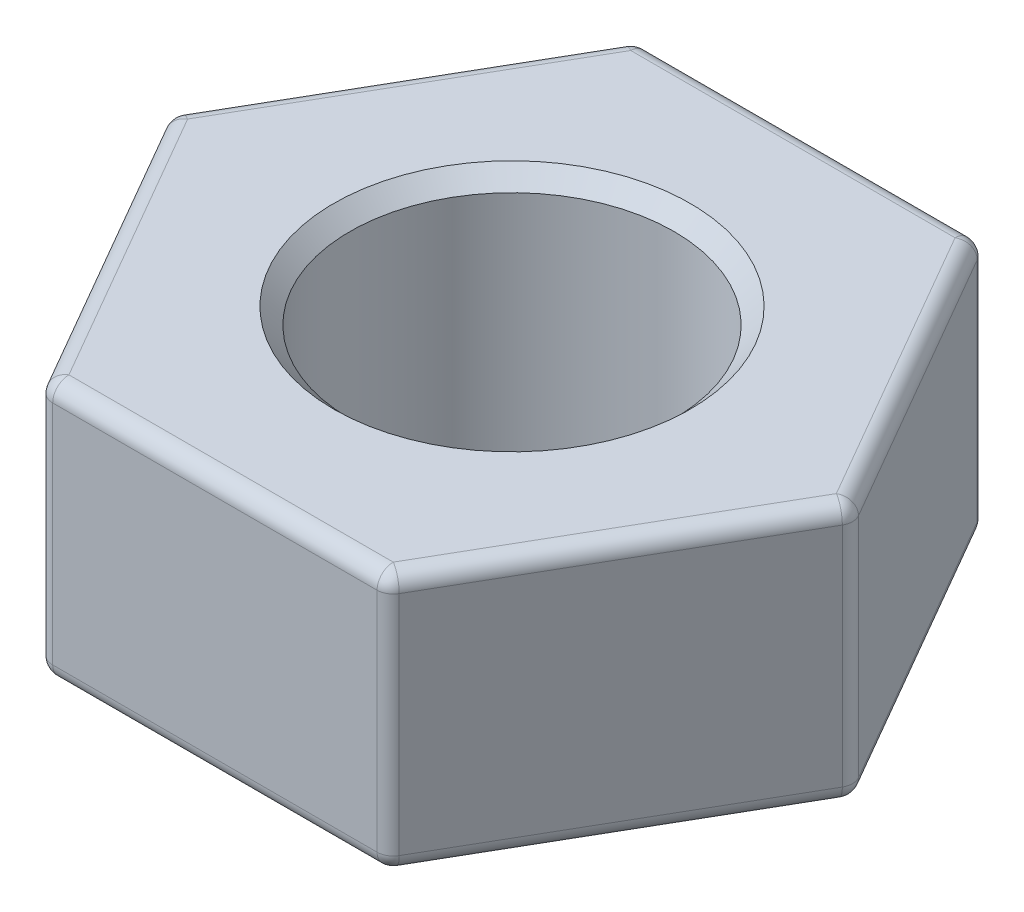
ISO-10303-21;
HEADER;
FILE_DESCRIPTION(('STEP AP214'),'2;1');
FILE_NAME('part.step','',(''),(''),'','','');
FILE_SCHEMA(('AUTOMOTIVE_DESIGN { 1 0 10303 214 1 1 1 1 }'));
ENDSEC;
DATA;
#1=APPLICATION_CONTEXT('core data for automotive mechanical design processes');
#2=APPLICATION_PROTOCOL_DEFINITION('international standard','automotive_design',2000,#1);
#3=PRODUCT_CONTEXT('',#1,'mechanical');
#4=PRODUCT('Part','Part','',(#3));
#5=PRODUCT_RELATED_PRODUCT_CATEGORY('part','',(#4));
#6=PRODUCT_DEFINITION_FORMATION('','',#4);
#7=PRODUCT_DEFINITION_CONTEXT('part definition',#1,'design');
#8=PRODUCT_DEFINITION('design','',#6,#7);
#9=PRODUCT_DEFINITION_SHAPE('','',#8);
#10=(LENGTH_UNIT() NAMED_UNIT(*) SI_UNIT(.MILLI.,.METRE.));
#11=(NAMED_UNIT(*) PLANE_ANGLE_UNIT() SI_UNIT($,.RADIAN.));
#12=(NAMED_UNIT(*) SI_UNIT($,.STERADIAN.) SOLID_ANGLE_UNIT());
#13=UNCERTAINTY_MEASURE_WITH_UNIT(LENGTH_MEASURE(1.E-05),#10,'distance_accuracy_value','');
#14=(GEOMETRIC_REPRESENTATION_CONTEXT(3) GLOBAL_UNCERTAINTY_ASSIGNED_CONTEXT((#13)) GLOBAL_UNIT_ASSIGNED_CONTEXT((#10,
#11,#12)) REPRESENTATION_CONTEXT('',''));
#15=CARTESIAN_POINT('',(0.,0.,0.));
#16=DIRECTION('',(0.,0.,1.));
#17=DIRECTION('',(1.,0.,0.));
#18=AXIS2_PLACEMENT_3D('',#15,#16,#17);
#19=CARTESIAN_POINT('',(0.,2.4,0.));
#20=DIRECTION('',(0.,1.,0.));
#21=DIRECTION('',(0.,0.,1.));
#22=AXIS2_PLACEMENT_3D('',#19,#20,#21);
#23=PLANE('',#22);
#24=CARTESIAN_POINT('',(0.,2.4,0.));
#25=DIRECTION('',(0.,1.,0.));
#26=DIRECTION('',(0.,0.,1.));
#27=AXIS2_PLACEMENT_3D('',#24,#25,#26);
#28=CIRCLE('',#27,1.65);
#29=CARTESIAN_POINT('',(0.,2.4,1.65));
#30=VERTEX_POINT('',#29);
#31=EDGE_CURVE('E11',#30,#30,#28,.F.);
#32=ORIENTED_EDGE('',*,*,#31,.T.);
#33=EDGE_LOOP('',(#32));
#34=FACE_BOUND('',#33,.T.);
#35=DIRECTION('',(-0.499999999999995,0.,0.866025403784442));
#36=VECTOR('',#35,1.);
#37=CARTESIAN_POINT('',(-3.04552266997528,2.4,0.0750000000000215));
#38=LINE('',#37,#36);
#39=CARTESIAN_POINT('',(-1.50111069989304,2.4,-2.59999999999999));
#40=VERTEX_POINT('',#39);
#41=CARTESIAN_POINT('',(-3.00222139978605,2.4,0.));
#42=VERTEX_POINT('',#41);
#43=EDGE_CURVE('E58',#40,#42,#38,.T.);
#44=ORIENTED_EDGE('',*,*,#43,.T.);
#45=DIRECTION('',(0.500000000000007,0.,0.866025403784435));
#46=VECTOR('',#45,1.);
#47=CARTESIAN_POINT('',(-1.45780942970378,2.4,2.67500000000002));
#48=LINE('',#47,#46);
#49=CARTESIAN_POINT('',(-1.501110699893,2.4,2.60000000000002));
#50=VERTEX_POINT('',#49);
#51=EDGE_CURVE('E317',#42,#50,#48,.T.);
#52=ORIENTED_EDGE('',*,*,#51,.T.);
#53=DIRECTION('',(1.,0.,0.));
#54=VECTOR('',#53,1.);
#55=CARTESIAN_POINT('',(1.5877132402715,2.4,2.59999999999998));
#56=LINE('',#55,#54);
#57=CARTESIAN_POINT('',(1.50111069989306,2.4,2.59999999999998));
#58=VERTEX_POINT('',#57);
#59=EDGE_CURVE('E463',#50,#58,#56,.T.);
#60=ORIENTED_EDGE('',*,*,#59,.T.);
#61=DIRECTION('',(0.499999999999995,0.,-0.866025403784442));
#62=VECTOR('',#61,1.);
#63=CARTESIAN_POINT('',(3.04552266997528,2.4,-0.0749999999999998));
#64=LINE('',#63,#62);
#65=CARTESIAN_POINT('',(3.00222139978606,2.4,0.));
#66=VERTEX_POINT('',#65);
#67=EDGE_CURVE('E466',#58,#66,#64,.T.);
#68=ORIENTED_EDGE('',*,*,#67,.T.);
#69=DIRECTION('',(-0.500000000000001,0.,-0.866025403784438));
#70=VECTOR('',#69,1.);
#71=CARTESIAN_POINT('',(1.4578094297038,2.4,-2.675));
#72=LINE('',#71,#70);
#73=CARTESIAN_POINT('',(1.50111069989302,2.4,-2.6));
#74=VERTEX_POINT('',#73);
#75=EDGE_CURVE('E469',#66,#74,#72,.T.);
#76=ORIENTED_EDGE('',*,*,#75,.T.);
#77=DIRECTION('',(-1.,0.,0.));
#78=VECTOR('',#77,1.);
#79=CARTESIAN_POINT('',(-1.58771324027148,2.4,-2.59999999999999));
#80=LINE('',#79,#78);
#81=EDGE_CURVE('E63',#74,#40,#80,.T.);
#82=ORIENTED_EDGE('',*,*,#81,.T.);
#83=EDGE_LOOP('',(#44,#52,#60,#68,#76,#82));
#84=FACE_BOUND('',#83,.T.);
#85=ADVANCED_FACE('F41',(#34,#84),#23,.T.);
#86=CARTESIAN_POINT('',(0.,0.,0.));
#87=DIRECTION('',(0.,1.,0.));
#88=DIRECTION('',(0.,0.,1.));
#89=AXIS2_PLACEMENT_3D('',#86,#87,#88);
#90=PLANE('',#89);
#91=CARTESIAN_POINT('',(0.,0.,0.));
#92=DIRECTION('',(0.,1.,0.));
#93=DIRECTION('',(0.,0.,1.));
#94=AXIS2_PLACEMENT_3D('',#91,#92,#93);
#95=CIRCLE('',#94,1.65);
#96=CARTESIAN_POINT('',(0.,0.,1.65));
#97=VERTEX_POINT('',#96);
#98=EDGE_CURVE('E312',#97,#97,#95,.T.);
#99=ORIENTED_EDGE('',*,*,#98,.T.);
#100=EDGE_LOOP('',(#99));
#101=FACE_BOUND('',#100,.T.);
#102=DIRECTION('',(-0.500000000000001,0.,-0.866025403784438));
#103=VECTOR('',#102,1.);
#104=CARTESIAN_POINT('',(2.25166604983954,0.,-1.3));
#105=LINE('',#104,#103);
#106=CARTESIAN_POINT('',(1.50111069989302,0.,-2.6));
#107=VERTEX_POINT('',#106);
#108=CARTESIAN_POINT('',(3.00222139978606,0.,0.));
#109=VERTEX_POINT('',#108);
#110=EDGE_CURVE('E339',#107,#109,#105,.F.);
#111=ORIENTED_EDGE('',*,*,#110,.T.);
#112=DIRECTION('',(0.499999999999995,0.,-0.866025403784442));
#113=VECTOR('',#112,1.);
#114=CARTESIAN_POINT('',(2.25166604983956,0.,1.29999999999999));
#115=LINE('',#114,#113);
#116=CARTESIAN_POINT('',(1.50111069989306,0.,2.59999999999998));
#117=VERTEX_POINT('',#116);
#118=EDGE_CURVE('E342',#109,#117,#115,.F.);
#119=ORIENTED_EDGE('',*,*,#118,.T.);
#120=DIRECTION('',(1.,0.,0.));
#121=VECTOR('',#120,1.);
#122=CARTESIAN_POINT('',(0.,0.,2.6));
#123=LINE('',#122,#121);
#124=CARTESIAN_POINT('',(-1.501110699893,0.,2.60000000000002));
#125=VERTEX_POINT('',#124);
#126=EDGE_CURVE('E368',#117,#125,#123,.F.);
#127=ORIENTED_EDGE('',*,*,#126,.T.);
#128=DIRECTION('',(0.500000000000007,0.,0.866025403784435));
#129=VECTOR('',#128,1.);
#130=CARTESIAN_POINT('',(-2.25166604983953,0.,1.30000000000002));
#131=LINE('',#130,#129);
#132=CARTESIAN_POINT('',(-3.00222139978605,0.,0.));
#133=VERTEX_POINT('',#132);
#134=EDGE_CURVE('E395',#125,#133,#131,.F.);
#135=ORIENTED_EDGE('',*,*,#134,.T.);
#136=DIRECTION('',(-0.499999999999995,0.,0.866025403784442));
#137=VECTOR('',#136,1.);
#138=CARTESIAN_POINT('',(-2.25166604983955,0.,-1.29999999999999));
#139=LINE('',#138,#137);
#140=CARTESIAN_POINT('',(-1.50111069989304,0.,-2.59999999999999));
#141=VERTEX_POINT('',#140);
#142=EDGE_CURVE('E398',#133,#141,#139,.F.);
#143=ORIENTED_EDGE('',*,*,#142,.T.);
#144=DIRECTION('',(-1.,0.,0.));
#145=VECTOR('',#144,1.);
#146=CARTESIAN_POINT('',(0.,0.,-2.6));
#147=LINE('',#146,#145);
#148=EDGE_CURVE('E344',#141,#107,#147,.F.);
#149=ORIENTED_EDGE('',*,*,#148,.T.);
#150=EDGE_LOOP('',(#111,#119,#127,#135,#143,#149));
#151=FACE_BOUND('',#150,.T.);
#152=ADVANCED_FACE('F333',(#101,#151),#90,.F.);
#153=CARTESIAN_POINT('',(1.5877132402715,2.4,2.74999999999998));
#154=DIRECTION('',(-0.866025403784441,0.,-0.499999999999995));
#155=DIRECTION('',(-0.499999999999995,0.,0.866025403784442));
#156=AXIS2_PLACEMENT_3D('',#153,#154,#155);
#157=PLANE('',#156);
#158=DIRECTION('',(0.,-1.,0.));
#159=VECTOR('',#158,1.);
#160=CARTESIAN_POINT('',(1.63101451046072,2.4,2.67499999999998));
#161=LINE('',#160,#159);
#162=CARTESIAN_POINT('',(1.63101451046072,2.25,2.67499999999998));
#163=VERTEX_POINT('',#162);
#164=CARTESIAN_POINT('',(1.63101451046072,0.15,2.67499999999998));
#165=VERTEX_POINT('',#164);
#166=EDGE_CURVE('E178',#163,#165,#161,.T.);
#167=ORIENTED_EDGE('',*,*,#166,.T.);
#168=DIRECTION('',(0.499999999999995,0.,-0.866025403784442));
#169=VECTOR('',#168,1.);
#170=CARTESIAN_POINT('',(1.5877132402715,0.15,2.74999999999998));
#171=LINE('',#170,#169);
#172=CARTESIAN_POINT('',(3.13212521035372,0.15,0.0749999999999997));
#173=VERTEX_POINT('',#172);
#174=EDGE_CURVE('E173',#165,#173,#171,.T.);
#175=ORIENTED_EDGE('',*,*,#174,.T.);
#176=DIRECTION('',(0.,-1.,0.));
#177=VECTOR('',#176,1.);
#178=CARTESIAN_POINT('',(3.13212521035372,2.4,0.0749999999999991));
#179=LINE('',#178,#177);
#180=CARTESIAN_POINT('',(3.13212521035372,2.25,0.0749999999999997));
#181=VERTEX_POINT('',#180);
#182=EDGE_CURVE('E167',#173,#181,#179,.F.);
#183=ORIENTED_EDGE('',*,*,#182,.T.);
#184=DIRECTION('',(0.499999999999995,0.,-0.866025403784442));
#185=VECTOR('',#184,1.);
#186=CARTESIAN_POINT('',(1.5877132402715,2.25,2.74999999999998));
#187=LINE('',#186,#185);
#188=EDGE_CURVE('E170',#181,#163,#187,.F.);
#189=ORIENTED_EDGE('',*,*,#188,.T.);
#190=EDGE_LOOP('',(#167,#175,#183,#189));
#191=FACE_BOUND('',#190,.T.);
#192=ADVANCED_FACE('F169',(#191),#157,.F.);
#193=CARTESIAN_POINT('',(3.17542648054294,2.4,0.));
#194=DIRECTION('',(-0.866025403784438,0.,0.500000000000001));
#195=DIRECTION('',(0.500000000000001,0.,0.866025403784438));
#196=AXIS2_PLACEMENT_3D('',#193,#194,#195);
#197=PLANE('',#196);
#198=DIRECTION('',(0.,-1.,0.));
#199=VECTOR('',#198,1.);
#200=CARTESIAN_POINT('',(3.13212521035372,2.4,-0.0749999999999994));
#201=LINE('',#200,#199);
#202=CARTESIAN_POINT('',(3.13212521035372,2.25,-0.0749999999999994));
#203=VERTEX_POINT('',#202);
#204=CARTESIAN_POINT('',(3.13212521035372,0.15,-0.0749999999999994));
#205=VERTEX_POINT('',#204);
#206=EDGE_CURVE('E203',#203,#205,#201,.T.);
#207=ORIENTED_EDGE('',*,*,#206,.T.);
#208=DIRECTION('',(-0.500000000000001,0.,-0.866025403784438));
#209=VECTOR('',#208,1.);
#210=CARTESIAN_POINT('',(3.17542648054294,0.15,0.));
#211=LINE('',#210,#209);
#212=CARTESIAN_POINT('',(1.63101451046069,0.15,-2.675));
#213=VERTEX_POINT('',#212);
#214=EDGE_CURVE('E354',#205,#213,#211,.T.);
#215=ORIENTED_EDGE('',*,*,#214,.T.);
#216=DIRECTION('',(0.,-1.,0.));
#217=VECTOR('',#216,1.);
#218=CARTESIAN_POINT('',(1.63101451046069,2.4,-2.675));
#219=LINE('',#218,#217);
#220=CARTESIAN_POINT('',(1.63101451046069,2.25,-2.675));
#221=VERTEX_POINT('',#220);
#222=EDGE_CURVE('E456',#213,#221,#219,.F.);
#223=ORIENTED_EDGE('',*,*,#222,.T.);
#224=DIRECTION('',(-0.500000000000001,0.,-0.866025403784438));
#225=VECTOR('',#224,1.);
#226=CARTESIAN_POINT('',(3.17542648054294,2.25,0.));
#227=LINE('',#226,#225);
#228=EDGE_CURVE('E453',#221,#203,#227,.F.);
#229=ORIENTED_EDGE('',*,*,#228,.T.);
#230=EDGE_LOOP('',(#207,#215,#223,#229));
#231=FACE_BOUND('',#230,.T.);
#232=ADVANCED_FACE('F534',(#231),#197,.F.);
#233=CARTESIAN_POINT('',(1.58771324027147,2.4,-2.75));
#234=DIRECTION('',(0.,0.,1.));
#235=DIRECTION('',(1.,0.,0.));
#236=AXIS2_PLACEMENT_3D('',#233,#234,#235);
#237=PLANE('',#236);
#238=DIRECTION('',(0.,-1.,0.));
#239=VECTOR('',#238,1.);
#240=CARTESIAN_POINT('',(1.50111069989302,2.4,-2.75));
#241=LINE('',#240,#239);
#242=CARTESIAN_POINT('',(1.50111069989302,2.25,-2.75));
#243=VERTEX_POINT('',#242);
#244=CARTESIAN_POINT('',(1.50111069989302,0.15,-2.75));
#245=VERTEX_POINT('',#244);
#246=EDGE_CURVE('E443',#243,#245,#241,.T.);
#247=ORIENTED_EDGE('',*,*,#246,.T.);
#248=DIRECTION('',(-1.,0.,0.));
#249=VECTOR('',#248,1.);
#250=CARTESIAN_POINT('',(1.58771324027147,0.15,-2.75));
#251=LINE('',#250,#249);
#252=CARTESIAN_POINT('',(-1.50111069989304,0.15,-2.74999999999999));
#253=VERTEX_POINT('',#252);
#254=EDGE_CURVE('E449',#245,#253,#251,.T.);
#255=ORIENTED_EDGE('',*,*,#254,.T.);
#256=DIRECTION('',(0.,-1.,0.));
#257=VECTOR('',#256,1.);
#258=CARTESIAN_POINT('',(-1.50111069989304,2.4,-2.74999999999999));
#259=LINE('',#258,#257);
#260=CARTESIAN_POINT('',(-1.50111069989304,2.25,-2.74999999999999));
#261=VERTEX_POINT('',#260);
#262=EDGE_CURVE('E446',#253,#261,#259,.F.);
#263=ORIENTED_EDGE('',*,*,#262,.T.);
#264=DIRECTION('',(-1.,0.,0.));
#265=VECTOR('',#264,1.);
#266=CARTESIAN_POINT('',(1.58771324027147,2.25,-2.75));
#267=LINE('',#266,#265);
#268=EDGE_CURVE('E440',#261,#243,#267,.F.);
#269=ORIENTED_EDGE('',*,*,#268,.T.);
#270=EDGE_LOOP('',(#247,#255,#263,#269));
#271=FACE_BOUND('',#270,.T.);
#272=ADVANCED_FACE('F547',(#271),#237,.F.);
#273=CARTESIAN_POINT('',(-1.58771324027148,2.4,-2.74999999999999));
#274=DIRECTION('',(0.866025403784442,0.,0.499999999999995));
#275=DIRECTION('',(0.499999999999995,0.,-0.866025403784442));
#276=AXIS2_PLACEMENT_3D('',#273,#274,#275);
#277=PLANE('',#276);
#278=DIRECTION('',(0.,-1.,0.));
#279=VECTOR('',#278,1.);
#280=CARTESIAN_POINT('',(-1.63101451046071,2.4,-2.67499999999999));
#281=LINE('',#280,#279);
#282=CARTESIAN_POINT('',(-1.63101451046071,2.25,-2.67499999999999));
#283=VERTEX_POINT('',#282);
#284=CARTESIAN_POINT('',(-1.63101451046071,0.15,-2.67499999999999));
#285=VERTEX_POINT('',#284);
#286=EDGE_CURVE('E430',#283,#285,#281,.T.);
#287=ORIENTED_EDGE('',*,*,#286,.T.);
#288=DIRECTION('',(-0.499999999999995,0.,0.866025403784442));
#289=VECTOR('',#288,1.);
#290=CARTESIAN_POINT('',(-1.58771324027148,0.15,-2.74999999999999));
#291=LINE('',#290,#289);
#292=CARTESIAN_POINT('',(-3.13212521035372,0.15,-0.0749999999999785));
#293=VERTEX_POINT('',#292);
#294=EDGE_CURVE('E436',#285,#293,#291,.T.);
#295=ORIENTED_EDGE('',*,*,#294,.T.);
#296=DIRECTION('',(0.,-1.,0.));
#297=VECTOR('',#296,1.);
#298=CARTESIAN_POINT('',(-3.13212521035372,2.4,-0.0749999999999792));
#299=LINE('',#298,#297);
#300=CARTESIAN_POINT('',(-3.13212521035372,2.25,-0.0749999999999785));
#301=VERTEX_POINT('',#300);
#302=EDGE_CURVE('E433',#293,#301,#299,.F.);
#303=ORIENTED_EDGE('',*,*,#302,.T.);
#304=DIRECTION('',(-0.499999999999995,0.,0.866025403784442));
#305=VECTOR('',#304,1.);
#306=CARTESIAN_POINT('',(-1.58771324027148,2.25,-2.74999999999999));
#307=LINE('',#306,#305);
#308=EDGE_CURVE('E427',#301,#283,#307,.F.);
#309=ORIENTED_EDGE('',*,*,#308,.T.);
#310=EDGE_LOOP('',(#287,#295,#303,#309));
#311=FACE_BOUND('',#310,.T.);
#312=ADVANCED_FACE('F593',(#311),#277,.F.);
#313=CARTESIAN_POINT('',(-3.17542648054294,2.4,0.));
#314=DIRECTION('',(0.866025403784435,0.,-0.500000000000007));
#315=DIRECTION('',(-0.500000000000007,0.,-0.866025403784435));
#316=AXIS2_PLACEMENT_3D('',#313,#314,#315);
#317=PLANE('',#316);
#318=DIRECTION('',(0.,-1.,0.));
#319=VECTOR('',#318,1.);
#320=CARTESIAN_POINT('',(-3.13212521035372,2.4,0.0750000000000217));
#321=LINE('',#320,#319);
#322=CARTESIAN_POINT('',(-3.13212521035372,2.25,0.0750000000000218));
#323=VERTEX_POINT('',#322);
#324=CARTESIAN_POINT('',(-3.13212521035372,0.15,0.0750000000000218));
#325=VERTEX_POINT('',#324);
#326=EDGE_CURVE('E417',#323,#325,#321,.T.);
#327=ORIENTED_EDGE('',*,*,#326,.T.);
#328=DIRECTION('',(0.500000000000007,0.,0.866025403784435));
#329=VECTOR('',#328,1.);
#330=CARTESIAN_POINT('',(-3.17542648054294,0.15,0.));
#331=LINE('',#330,#329);
#332=CARTESIAN_POINT('',(-1.63101451046067,0.15,2.67500000000002));
#333=VERTEX_POINT('',#332);
#334=EDGE_CURVE('E423',#325,#333,#331,.T.);
#335=ORIENTED_EDGE('',*,*,#334,.T.);
#336=DIRECTION('',(0.,-1.,0.));
#337=VECTOR('',#336,1.);
#338=CARTESIAN_POINT('',(-1.63101451046067,2.4,2.67500000000002));
#339=LINE('',#338,#337);
#340=CARTESIAN_POINT('',(-1.63101451046067,2.25,2.67500000000002));
#341=VERTEX_POINT('',#340);
#342=EDGE_CURVE('E420',#333,#341,#339,.F.);
#343=ORIENTED_EDGE('',*,*,#342,.T.);
#344=DIRECTION('',(0.500000000000007,0.,0.866025403784435));
#345=VECTOR('',#344,1.);
#346=CARTESIAN_POINT('',(-3.17542648054294,2.25,0.));
#347=LINE('',#346,#345);
#348=EDGE_CURVE('E414',#341,#323,#347,.F.);
#349=ORIENTED_EDGE('',*,*,#348,.T.);
#350=EDGE_LOOP('',(#327,#335,#343,#349));
#351=FACE_BOUND('',#350,.T.);
#352=ADVANCED_FACE('F567',(#351),#317,.F.);
#353=CARTESIAN_POINT('',(-1.58771324027145,2.4,2.75000000000002));
#354=DIRECTION('',(0.,0.,-1.));
#355=DIRECTION('',(-1.,0.,0.));
#356=AXIS2_PLACEMENT_3D('',#353,#354,#355);
#357=PLANE('',#356);
#358=DIRECTION('',(0.,-1.,0.));
#359=VECTOR('',#358,1.);
#360=CARTESIAN_POINT('',(-1.501110699893,2.4,2.75000000000002));
#361=LINE('',#360,#359);
#362=CARTESIAN_POINT('',(-1.501110699893,2.25,2.75000000000002));
#363=VERTEX_POINT('',#362);
#364=CARTESIAN_POINT('',(-1.501110699893,0.15,2.75000000000002));
#365=VERTEX_POINT('',#364);
#366=EDGE_CURVE('E404',#363,#365,#361,.T.);
#367=ORIENTED_EDGE('',*,*,#366,.T.);
#368=DIRECTION('',(1.,0.,0.));
#369=VECTOR('',#368,1.);
#370=CARTESIAN_POINT('',(-1.58771324027145,0.15,2.75000000000002));
#371=LINE('',#370,#369);
#372=CARTESIAN_POINT('',(1.50111069989306,0.15,2.74999999999998));
#373=VERTEX_POINT('',#372);
#374=EDGE_CURVE('E410',#365,#373,#371,.T.);
#375=ORIENTED_EDGE('',*,*,#374,.T.);
#376=DIRECTION('',(0.,-1.,0.));
#377=VECTOR('',#376,1.);
#378=CARTESIAN_POINT('',(1.50111069989306,2.4,2.74999999999998));
#379=LINE('',#378,#377);
#380=CARTESIAN_POINT('',(1.50111069989306,2.25,2.74999999999998));
#381=VERTEX_POINT('',#380);
#382=EDGE_CURVE('E407',#373,#381,#379,.F.);
#383=ORIENTED_EDGE('',*,*,#382,.T.);
#384=DIRECTION('',(1.,0.,0.));
#385=VECTOR('',#384,1.);
#386=CARTESIAN_POINT('',(-1.58771324027145,2.25,2.75000000000002));
#387=LINE('',#386,#385);
#388=EDGE_CURVE('E367',#381,#363,#387,.F.);
#389=ORIENTED_EDGE('',*,*,#388,.T.);
#390=EDGE_LOOP('',(#367,#375,#383,#389));
#391=FACE_BOUND('',#390,.T.);
#392=ADVANCED_FACE('F492',(#391),#357,.F.);
#393=CARTESIAN_POINT('',(0.,2.4,0.));
#394=DIRECTION('',(0.,-1.,0.));
#395=DIRECTION('',(0.,0.,-1.));
#396=AXIS2_PLACEMENT_3D('',#393,#394,#395);
#397=CYLINDRICAL_SURFACE('',#396,1.5);
#398=CARTESIAN_POINT('',(0.,0.15,0.));
#399=DIRECTION('',(0.,1.,0.));
#400=DIRECTION('',(0.,0.,1.));
#401=AXIS2_PLACEMENT_3D('',#398,#399,#400);
#402=CIRCLE('',#401,1.5);
#403=CARTESIAN_POINT('',(0.,0.15,1.5));
#404=VERTEX_POINT('',#403);
#405=EDGE_CURVE('E51',#404,#404,#402,.F.);
#406=ORIENTED_EDGE('',*,*,#405,.T.);
#407=EDGE_LOOP('',(#406));
#408=FACE_BOUND('',#407,.T.);
#409=CARTESIAN_POINT('',(0.,2.25,0.));
#410=DIRECTION('',(0.,1.,0.));
#411=DIRECTION('',(0.,0.,1.));
#412=AXIS2_PLACEMENT_3D('',#409,#410,#411);
#413=CIRCLE('',#412,1.5);
#414=CARTESIAN_POINT('',(0.,2.25,1.5));
#415=VERTEX_POINT('',#414);
#416=EDGE_CURVE('E316',#415,#415,#413,.T.);
#417=ORIENTED_EDGE('',*,*,#416,.T.);
#418=EDGE_LOOP('',(#417));
#419=FACE_BOUND('',#418,.T.);
#420=ADVANCED_FACE('F324',(#408,#419),#397,.F.);
#421=CARTESIAN_POINT('',(-2.25166604983955,2.25,-1.29999999999999));
#422=DIRECTION('',(0.499999999999995,0.,-0.866025403784442));
#423=DIRECTION('',(-0.866025403784442,0.,-0.499999999999995));
#424=AXIS2_PLACEMENT_3D('',#421,#422,#423);
#425=CYLINDRICAL_SURFACE('',#424,0.15);
#426=CARTESIAN_POINT('',(-3.00222139978605,2.25,0.));
#427=DIRECTION('',(-0.499999999999997,0.,0.86602540378444));
#428=DIRECTION('',(0.86602540378444,0.,0.499999999999997));
#429=AXIS2_PLACEMENT_3D('',#426,#427,#428);
#430=CIRCLE('',#429,0.15);
#431=EDGE_CURVE('E191',#42,#301,#430,.T.);
#432=ORIENTED_EDGE('',*,*,#431,.F.);
#433=ORIENTED_EDGE('',*,*,#43,.F.);
#434=CARTESIAN_POINT('',(-1.50111069989304,2.25,-2.59999999999999));
#435=DIRECTION('',(0.499999999999995,0.,-0.866025403784442));
#436=DIRECTION('',(-0.866025403784442,0.,-0.499999999999995));
#437=AXIS2_PLACEMENT_3D('',#434,#435,#436);
#438=CIRCLE('',#437,0.15);
#439=EDGE_CURVE('E305',#283,#40,#438,.T.);
#440=ORIENTED_EDGE('',*,*,#439,.F.);
#441=ORIENTED_EDGE('',*,*,#308,.F.);
#442=EDGE_LOOP('',(#432,#433,#440,#441));
#443=FACE_BOUND('',#442,.T.);
#444=ADVANCED_FACE('F557',(#443),#425,.T.);
#445=CARTESIAN_POINT('',(-3.00222139978605,2.25,0.));
#446=DIRECTION('',(0.,0.,1.));
#447=DIRECTION('',(1.,0.,0.));
#448=AXIS2_PLACEMENT_3D('',#445,#446,#447);
#449=SPHERICAL_SURFACE('',#448,0.15);
#450=CARTESIAN_POINT('',(-3.00222139978605,2.25,0.));
#451=DIRECTION('',(-0.500000000000007,0.,-0.866025403784435));
#452=DIRECTION('',(-0.866025403784435,0.,0.500000000000007));
#453=AXIS2_PLACEMENT_3D('',#450,#451,#452);
#454=CIRCLE('',#453,0.15);
#455=EDGE_CURVE('E297',#42,#323,#454,.F.);
#456=ORIENTED_EDGE('',*,*,#455,.F.);
#457=ORIENTED_EDGE('',*,*,#431,.T.);
#458=CARTESIAN_POINT('',(-3.00222139978605,2.25,0.));
#459=DIRECTION('',(0.,1.,0.));
#460=DIRECTION('',(0.,0.,1.));
#461=AXIS2_PLACEMENT_3D('',#458,#459,#460);
#462=CIRCLE('',#461,0.15);
#463=EDGE_CURVE('E301',#323,#301,#462,.F.);
#464=ORIENTED_EDGE('',*,*,#463,.F.);
#465=EDGE_LOOP('',(#456,#457,#464));
#466=FACE_BOUND('',#465,.T.);
#467=ADVANCED_FACE('F559',(#466),#449,.T.);
#468=CARTESIAN_POINT('',(-1.50111069989304,2.25,-2.59999999999999));
#469=DIRECTION('',(0.,0.,1.));
#470=DIRECTION('',(1.,0.,0.));
#471=AXIS2_PLACEMENT_3D('',#468,#469,#470);
#472=SPHERICAL_SURFACE('',#471,0.15);
#473=CARTESIAN_POINT('',(-1.50111069989304,2.25,-2.59999999999999));
#474=DIRECTION('',(0.,1.,0.));
#475=DIRECTION('',(0.,0.,1.));
#476=AXIS2_PLACEMENT_3D('',#473,#474,#475);
#477=CIRCLE('',#476,0.15);
#478=EDGE_CURVE('E289',#283,#261,#477,.F.);
#479=ORIENTED_EDGE('',*,*,#478,.F.);
#480=ORIENTED_EDGE('',*,*,#439,.T.);
#481=CARTESIAN_POINT('',(-1.50111069989304,2.25,-2.59999999999999));
#482=DIRECTION('',(-1.,0.,0.));
#483=DIRECTION('',(0.,0.,1.));
#484=AXIS2_PLACEMENT_3D('',#481,#482,#483);
#485=CIRCLE('',#484,0.15);
#486=EDGE_CURVE('E293',#261,#40,#485,.F.);
#487=ORIENTED_EDGE('',*,*,#486,.F.);
#488=EDGE_LOOP('',(#479,#480,#487));
#489=FACE_BOUND('',#488,.T.);
#490=ADVANCED_FACE('F553',(#489),#472,.T.);
#491=CARTESIAN_POINT('',(-3.00222139978605,2.4,0.));
#492=DIRECTION('',(0.,-1.,0.));
#493=DIRECTION('',(0.,0.,-1.));
#494=AXIS2_PLACEMENT_3D('',#491,#492,#493);
#495=CYLINDRICAL_SURFACE('',#494,0.15);
#496=ORIENTED_EDGE('',*,*,#463,.T.);
#497=ORIENTED_EDGE('',*,*,#302,.F.);
#498=CARTESIAN_POINT('',(-3.00222139978605,0.15,0.));
#499=DIRECTION('',(0.,-1.,0.));
#500=DIRECTION('',(0.,0.,-1.));
#501=AXIS2_PLACEMENT_3D('',#498,#499,#500);
#502=CIRCLE('',#501,0.15);
#503=EDGE_CURVE('E282',#325,#293,#502,.T.);
#504=ORIENTED_EDGE('',*,*,#503,.F.);
#505=ORIENTED_EDGE('',*,*,#326,.F.);
#506=EDGE_LOOP('',(#496,#497,#504,#505));
#507=FACE_BOUND('',#506,.T.);
#508=ADVANCED_FACE('F564',(#507),#495,.T.);
#509=CARTESIAN_POINT('',(-2.25166604983953,2.25,1.30000000000002));
#510=DIRECTION('',(-0.500000000000007,0.,-0.866025403784435));
#511=DIRECTION('',(-0.866025403784435,0.,0.500000000000007));
#512=AXIS2_PLACEMENT_3D('',#509,#510,#511);
#513=CYLINDRICAL_SURFACE('',#512,0.15);
#514=ORIENTED_EDGE('',*,*,#455,.T.);
#515=ORIENTED_EDGE('',*,*,#348,.F.);
#516=CARTESIAN_POINT('',(-1.501110699893,2.25,2.60000000000002));
#517=DIRECTION('',(0.500000000000004,0.,0.866025403784437));
#518=DIRECTION('',(0.866025403784437,0.,-0.500000000000004));
#519=AXIS2_PLACEMENT_3D('',#516,#517,#518);
#520=CIRCLE('',#519,0.15);
#521=EDGE_CURVE('E278',#50,#341,#520,.T.);
#522=ORIENTED_EDGE('',*,*,#521,.F.);
#523=ORIENTED_EDGE('',*,*,#51,.F.);
#524=EDGE_LOOP('',(#514,#515,#522,#523));
#525=FACE_BOUND('',#524,.T.);
#526=ADVANCED_FACE('F478',(#525),#513,.T.);
#527=CARTESIAN_POINT('',(0.,2.25,-2.6));
#528=DIRECTION('',(1.,0.,0.));
#529=DIRECTION('',(0.,0.,-1.));
#530=AXIS2_PLACEMENT_3D('',#527,#528,#529);
#531=CYLINDRICAL_SURFACE('',#530,0.15);
#532=ORIENTED_EDGE('',*,*,#486,.T.);
#533=ORIENTED_EDGE('',*,*,#81,.F.);
#534=CARTESIAN_POINT('',(1.50111069989302,2.25,-2.6));
#535=DIRECTION('',(1.,0.,0.));
#536=DIRECTION('',(0.,0.,-1.));
#537=AXIS2_PLACEMENT_3D('',#534,#535,#536);
#538=CIRCLE('',#537,0.15);
#539=EDGE_CURVE('E274',#243,#74,#538,.T.);
#540=ORIENTED_EDGE('',*,*,#539,.F.);
#541=ORIENTED_EDGE('',*,*,#268,.F.);
#542=EDGE_LOOP('',(#532,#533,#540,#541));
#543=FACE_BOUND('',#542,.T.);
#544=ADVANCED_FACE('F541',(#543),#531,.T.);
#545=CARTESIAN_POINT('',(-1.50111069989304,2.4,-2.59999999999999));
#546=DIRECTION('',(0.,-1.,0.));
#547=DIRECTION('',(0.,0.,-1.));
#548=AXIS2_PLACEMENT_3D('',#545,#546,#547);
#549=CYLINDRICAL_SURFACE('',#548,0.15);
#550=ORIENTED_EDGE('',*,*,#478,.T.);
#551=ORIENTED_EDGE('',*,*,#262,.F.);
#552=CARTESIAN_POINT('',(-1.50111069989304,0.15,-2.59999999999999));
#553=DIRECTION('',(0.,-1.,0.));
#554=DIRECTION('',(0.,0.,-1.));
#555=AXIS2_PLACEMENT_3D('',#552,#553,#554);
#556=CIRCLE('',#555,0.15);
#557=EDGE_CURVE('E270',#285,#253,#556,.T.);
#558=ORIENTED_EDGE('',*,*,#557,.F.);
#559=ORIENTED_EDGE('',*,*,#286,.F.);
#560=EDGE_LOOP('',(#550,#551,#558,#559));
#561=FACE_BOUND('',#560,.T.);
#562=ADVANCED_FACE('F551',(#561),#549,.T.);
#563=CARTESIAN_POINT('',(-1.45780942970382,0.15,-2.67499999999999));
#564=DIRECTION('',(-0.499999999999995,0.,0.866025403784442));
#565=DIRECTION('',(0.866025403784442,0.,0.499999999999995));
#566=AXIS2_PLACEMENT_3D('',#563,#564,#565);
#567=CYLINDRICAL_SURFACE('',#566,0.15);
#568=CARTESIAN_POINT('',(-3.00222139978605,0.15,0.));
#569=DIRECTION('',(-0.499999999999995,0.,0.866025403784441));
#570=DIRECTION('',(0.866025403784441,0.,0.499999999999995));
#571=AXIS2_PLACEMENT_3D('',#568,#569,#570);
#572=CIRCLE('',#571,0.15);
#573=EDGE_CURVE('E285',#293,#133,#572,.T.);
#574=ORIENTED_EDGE('',*,*,#573,.F.);
#575=ORIENTED_EDGE('',*,*,#294,.F.);
#576=CARTESIAN_POINT('',(-1.50111069989304,0.15,-2.59999999999999));
#577=DIRECTION('',(0.499999999999995,0.,-0.866025403784442));
#578=DIRECTION('',(-0.866025403784442,0.,-0.499999999999995));
#579=AXIS2_PLACEMENT_3D('',#576,#577,#578);
#580=CIRCLE('',#579,0.15);
#581=EDGE_CURVE('E266',#141,#285,#580,.T.);
#582=ORIENTED_EDGE('',*,*,#581,.F.);
#583=ORIENTED_EDGE('',*,*,#142,.F.);
#584=EDGE_LOOP('',(#574,#575,#582,#583));
#585=FACE_BOUND('',#584,.T.);
#586=ADVANCED_FACE('F515',(#585),#567,.T.);
#587=CARTESIAN_POINT('',(-3.00222139978605,0.15,0.));
#588=DIRECTION('',(0.,0.,1.));
#589=DIRECTION('',(1.,0.,0.));
#590=AXIS2_PLACEMENT_3D('',#587,#588,#589);
#591=SPHERICAL_SURFACE('',#590,0.15);
#592=ORIENTED_EDGE('',*,*,#503,.T.);
#593=ORIENTED_EDGE('',*,*,#573,.T.);
#594=CARTESIAN_POINT('',(-3.00222139978605,0.15,0.));
#595=DIRECTION('',(-0.500000000000006,0.,-0.866025403784435));
#596=DIRECTION('',(-0.866025403784435,0.,0.500000000000006));
#597=AXIS2_PLACEMENT_3D('',#594,#595,#596);
#598=CIRCLE('',#597,0.15);
#599=EDGE_CURVE('E262',#325,#133,#598,.F.);
#600=ORIENTED_EDGE('',*,*,#599,.F.);
#601=EDGE_LOOP('',(#592,#593,#600));
#602=FACE_BOUND('',#601,.T.);
#603=ADVANCED_FACE('F766',(#602),#591,.T.);
#604=CARTESIAN_POINT('',(-1.501110699893,2.25,2.60000000000002));
#605=DIRECTION('',(0.,0.,1.));
#606=DIRECTION('',(1.,0.,0.));
#607=AXIS2_PLACEMENT_3D('',#604,#605,#606);
#608=SPHERICAL_SURFACE('',#607,0.15);
#609=CARTESIAN_POINT('',(-1.501110699893,2.25,2.60000000000002));
#610=DIRECTION('',(-1.,0.,0.));
#611=DIRECTION('',(0.,0.,1.));
#612=AXIS2_PLACEMENT_3D('',#609,#610,#611);
#613=CIRCLE('',#612,0.15);
#614=EDGE_CURVE('E254',#50,#363,#613,.F.);
#615=ORIENTED_EDGE('',*,*,#614,.F.);
#616=ORIENTED_EDGE('',*,*,#521,.T.);
#617=CARTESIAN_POINT('',(-1.501110699893,2.25,2.60000000000002));
#618=DIRECTION('',(0.,1.,0.));
#619=DIRECTION('',(0.,0.,1.));
#620=AXIS2_PLACEMENT_3D('',#617,#618,#619);
#621=CIRCLE('',#620,0.15);
#622=EDGE_CURVE('E258',#363,#341,#621,.F.);
#623=ORIENTED_EDGE('',*,*,#622,.F.);
#624=EDGE_LOOP('',(#615,#616,#623));
#625=FACE_BOUND('',#624,.T.);
#626=ADVANCED_FACE('F485',(#625),#608,.T.);
#627=CARTESIAN_POINT('',(1.50111069989302,2.25,-2.6));
#628=DIRECTION('',(0.,0.,1.));
#629=DIRECTION('',(1.,0.,0.));
#630=AXIS2_PLACEMENT_3D('',#627,#628,#629);
#631=SPHERICAL_SURFACE('',#630,0.15);
#632=CARTESIAN_POINT('',(1.50111069989302,2.25,-2.6));
#633=DIRECTION('',(0.,1.,0.));
#634=DIRECTION('',(0.,0.,1.));
#635=AXIS2_PLACEMENT_3D('',#632,#633,#634);
#636=CIRCLE('',#635,0.15);
#637=EDGE_CURVE('E246',#243,#221,#636,.F.);
#638=ORIENTED_EDGE('',*,*,#637,.F.);
#639=ORIENTED_EDGE('',*,*,#539,.T.);
#640=CARTESIAN_POINT('',(1.50111069989302,2.25,-2.6));
#641=DIRECTION('',(-0.499999999999999,0.,-0.866025403784439));
#642=DIRECTION('',(-0.866025403784439,0.,0.499999999999999));
#643=AXIS2_PLACEMENT_3D('',#640,#641,#642);
#644=CIRCLE('',#643,0.15);
#645=EDGE_CURVE('E250',#221,#74,#644,.F.);
#646=ORIENTED_EDGE('',*,*,#645,.F.);
#647=EDGE_LOOP('',(#638,#639,#646));
#648=FACE_BOUND('',#647,.T.);
#649=ADVANCED_FACE('F545',(#648),#631,.T.);
#650=CARTESIAN_POINT('',(-1.50111069989304,0.15,-2.59999999999999));
#651=DIRECTION('',(0.,0.,1.));
#652=DIRECTION('',(1.,0.,0.));
#653=AXIS2_PLACEMENT_3D('',#650,#651,#652);
#654=SPHERICAL_SURFACE('',#653,0.15);
#655=ORIENTED_EDGE('',*,*,#581,.T.);
#656=ORIENTED_EDGE('',*,*,#557,.T.);
#657=CARTESIAN_POINT('',(-1.50111069989304,0.15,-2.59999999999999));
#658=DIRECTION('',(-1.,0.,0.));
#659=DIRECTION('',(0.,0.,1.));
#660=AXIS2_PLACEMENT_3D('',#657,#658,#659);
#661=CIRCLE('',#660,0.15);
#662=EDGE_CURVE('E243',#141,#253,#661,.F.);
#663=ORIENTED_EDGE('',*,*,#662,.F.);
#664=EDGE_LOOP('',(#655,#656,#663));
#665=FACE_BOUND('',#664,.T.);
#666=ADVANCED_FACE('F518',(#665),#654,.T.);
#667=CARTESIAN_POINT('',(-3.04552266997528,0.15,-0.0749999999999788));
#668=DIRECTION('',(0.500000000000007,0.,0.866025403784435));
#669=DIRECTION('',(0.866025403784435,0.,-0.500000000000007));
#670=AXIS2_PLACEMENT_3D('',#667,#668,#669);
#671=CYLINDRICAL_SURFACE('',#670,0.15);
#672=ORIENTED_EDGE('',*,*,#599,.T.);
#673=ORIENTED_EDGE('',*,*,#134,.F.);
#674=CARTESIAN_POINT('',(-1.501110699893,0.15,2.60000000000002));
#675=DIRECTION('',(0.500000000000006,0.,0.866025403784435));
#676=DIRECTION('',(0.866025403784435,0.,-0.500000000000006));
#677=AXIS2_PLACEMENT_3D('',#674,#675,#676);
#678=CIRCLE('',#677,0.15);
#679=EDGE_CURVE('E239',#333,#125,#678,.T.);
#680=ORIENTED_EDGE('',*,*,#679,.F.);
#681=ORIENTED_EDGE('',*,*,#334,.F.);
#682=EDGE_LOOP('',(#672,#673,#680,#681));
#683=FACE_BOUND('',#682,.T.);
#684=ADVANCED_FACE('F571',(#683),#671,.T.);
#685=CARTESIAN_POINT('',(-1.501110699893,2.4,2.60000000000002));
#686=DIRECTION('',(0.,-1.,0.));
#687=DIRECTION('',(0.,0.,-1.));
#688=AXIS2_PLACEMENT_3D('',#685,#686,#687);
#689=CYLINDRICAL_SURFACE('',#688,0.15);
#690=ORIENTED_EDGE('',*,*,#622,.T.);
#691=ORIENTED_EDGE('',*,*,#342,.F.);
#692=CARTESIAN_POINT('',(-1.501110699893,0.15,2.60000000000002));
#693=DIRECTION('',(0.,-1.,0.));
#694=DIRECTION('',(0.,0.,-1.));
#695=AXIS2_PLACEMENT_3D('',#692,#693,#694);
#696=CIRCLE('',#695,0.15);
#697=EDGE_CURVE('E236',#365,#333,#696,.T.);
#698=ORIENTED_EDGE('',*,*,#697,.F.);
#699=ORIENTED_EDGE('',*,*,#366,.F.);
#700=EDGE_LOOP('',(#690,#691,#698,#699));
#701=FACE_BOUND('',#700,.T.);
#702=ADVANCED_FACE('F489',(#701),#689,.T.);
#703=CARTESIAN_POINT('',(0.,2.25,2.6));
#704=DIRECTION('',(-1.,0.,0.));
#705=DIRECTION('',(0.,0.,1.));
#706=AXIS2_PLACEMENT_3D('',#703,#704,#705);
#707=CYLINDRICAL_SURFACE('',#706,0.15);
#708=ORIENTED_EDGE('',*,*,#614,.T.);
#709=ORIENTED_EDGE('',*,*,#388,.F.);
#710=CARTESIAN_POINT('',(1.50111069989306,2.25,2.59999999999998));
#711=DIRECTION('',(1.,0.,0.));
#712=DIRECTION('',(0.,0.,-1.));
#713=AXIS2_PLACEMENT_3D('',#710,#711,#712);
#714=CIRCLE('',#713,0.15);
#715=EDGE_CURVE('E232',#58,#381,#714,.T.);
#716=ORIENTED_EDGE('',*,*,#715,.F.);
#717=ORIENTED_EDGE('',*,*,#59,.F.);
#718=EDGE_LOOP('',(#708,#709,#716,#717));
#719=FACE_BOUND('',#718,.T.);
#720=ADVANCED_FACE('F496',(#719),#707,.T.);
#721=CARTESIAN_POINT('',(2.25166604983956,2.25,1.29999999999999));
#722=DIRECTION('',(-0.499999999999995,0.,0.866025403784442));
#723=DIRECTION('',(0.866025403784441,0.,0.499999999999995));
#724=AXIS2_PLACEMENT_3D('',#721,#722,#723);
#725=CYLINDRICAL_SURFACE('',#724,0.15);
#726=CARTESIAN_POINT('',(3.00222139978606,2.25,0.));
#727=DIRECTION('',(0.499999999999992,0.,-0.866025403784443));
#728=DIRECTION('',(-0.866025403784443,0.,-0.499999999999992));
#729=AXIS2_PLACEMENT_3D('',#726,#727,#728);
#730=CIRCLE('',#729,0.15);
#731=EDGE_CURVE('E185',#66,#181,#730,.T.);
#732=ORIENTED_EDGE('',*,*,#731,.F.);
#733=ORIENTED_EDGE('',*,*,#67,.F.);
#734=CARTESIAN_POINT('',(1.50111069989306,2.25,2.59999999999998));
#735=DIRECTION('',(-0.499999999999995,0.,0.866025403784442));
#736=DIRECTION('',(0.866025403784442,0.,0.499999999999995));
#737=AXIS2_PLACEMENT_3D('',#734,#735,#736);
#738=CIRCLE('',#737,0.15);
#739=EDGE_CURVE('E188',#163,#58,#738,.T.);
#740=ORIENTED_EDGE('',*,*,#739,.F.);
#741=ORIENTED_EDGE('',*,*,#188,.F.);
#742=EDGE_LOOP('',(#732,#733,#740,#741));
#743=FACE_BOUND('',#742,.T.);
#744=ADVANCED_FACE('F183',(#743),#725,.T.);
#745=CARTESIAN_POINT('',(2.25166604983954,2.25,-1.3));
#746=DIRECTION('',(0.500000000000001,0.,0.866025403784438));
#747=DIRECTION('',(0.866025403784438,0.,-0.500000000000001));
#748=AXIS2_PLACEMENT_3D('',#745,#746,#747);
#749=CYLINDRICAL_SURFACE('',#748,0.15);
#750=ORIENTED_EDGE('',*,*,#645,.T.);
#751=ORIENTED_EDGE('',*,*,#75,.F.);
#752=CARTESIAN_POINT('',(3.00222139978606,2.25,0.));
#753=DIRECTION('',(0.500000000000001,0.,0.866025403784438));
#754=DIRECTION('',(0.866025403784438,0.,-0.500000000000001));
#755=AXIS2_PLACEMENT_3D('',#752,#753,#754);
#756=CIRCLE('',#755,0.15);
#757=EDGE_CURVE('E199',#203,#66,#756,.T.);
#758=ORIENTED_EDGE('',*,*,#757,.F.);
#759=ORIENTED_EDGE('',*,*,#228,.F.);
#760=EDGE_LOOP('',(#750,#751,#758,#759));
#761=FACE_BOUND('',#760,.T.);
#762=ADVANCED_FACE('F538',(#761),#749,.T.);
#763=CARTESIAN_POINT('',(1.50111069989302,2.4,-2.6));
#764=DIRECTION('',(0.,-1.,0.));
#765=DIRECTION('',(0.,0.,-1.));
#766=AXIS2_PLACEMENT_3D('',#763,#764,#765);
#767=CYLINDRICAL_SURFACE('',#766,0.15);
#768=ORIENTED_EDGE('',*,*,#637,.T.);
#769=ORIENTED_EDGE('',*,*,#222,.F.);
#770=CARTESIAN_POINT('',(1.50111069989302,0.15,-2.6));
#771=DIRECTION('',(0.,-1.,0.));
#772=DIRECTION('',(0.,0.,-1.));
#773=AXIS2_PLACEMENT_3D('',#770,#771,#772);
#774=CIRCLE('',#773,0.15);
#775=EDGE_CURVE('E224',#245,#213,#774,.T.);
#776=ORIENTED_EDGE('',*,*,#775,.F.);
#777=ORIENTED_EDGE('',*,*,#246,.F.);
#778=EDGE_LOOP('',(#768,#769,#776,#777));
#779=FACE_BOUND('',#778,.T.);
#780=ADVANCED_FACE('F530',(#779),#767,.T.);
#781=CARTESIAN_POINT('',(1.58771324027147,0.15,-2.6));
#782=DIRECTION('',(-1.,0.,0.));
#783=DIRECTION('',(0.,0.,1.));
#784=AXIS2_PLACEMENT_3D('',#781,#782,#783);
#785=CYLINDRICAL_SURFACE('',#784,0.15);
#786=ORIENTED_EDGE('',*,*,#662,.T.);
#787=ORIENTED_EDGE('',*,*,#254,.F.);
#788=CARTESIAN_POINT('',(1.50111069989302,0.15,-2.6));
#789=DIRECTION('',(1.,0.,0.));
#790=DIRECTION('',(0.,0.,-1.));
#791=AXIS2_PLACEMENT_3D('',#788,#789,#790);
#792=CIRCLE('',#791,0.15);
#793=EDGE_CURVE('E220',#107,#245,#792,.T.);
#794=ORIENTED_EDGE('',*,*,#793,.F.);
#795=ORIENTED_EDGE('',*,*,#148,.F.);
#796=EDGE_LOOP('',(#786,#787,#794,#795));
#797=FACE_BOUND('',#796,.T.);
#798=ADVANCED_FACE('F522',(#797),#785,.T.);
#799=CARTESIAN_POINT('',(-1.501110699893,0.15,2.60000000000002));
#800=DIRECTION('',(0.,0.,1.));
#801=DIRECTION('',(1.,0.,0.));
#802=AXIS2_PLACEMENT_3D('',#799,#800,#801);
#803=SPHERICAL_SURFACE('',#802,0.15);
#804=ORIENTED_EDGE('',*,*,#697,.T.);
#805=ORIENTED_EDGE('',*,*,#679,.T.);
#806=CARTESIAN_POINT('',(-1.501110699893,0.15,2.60000000000002));
#807=DIRECTION('',(-1.,0.,0.));
#808=DIRECTION('',(0.,0.,1.));
#809=AXIS2_PLACEMENT_3D('',#806,#807,#808);
#810=CIRCLE('',#809,0.15);
#811=EDGE_CURVE('E211',#365,#125,#810,.F.);
#812=ORIENTED_EDGE('',*,*,#811,.F.);
#813=EDGE_LOOP('',(#804,#805,#812));
#814=FACE_BOUND('',#813,.T.);
#815=ADVANCED_FACE('F573',(#814),#803,.T.);
#816=CARTESIAN_POINT('',(1.50111069989306,2.25,2.59999999999998));
#817=DIRECTION('',(0.,0.,1.));
#818=DIRECTION('',(1.,0.,0.));
#819=AXIS2_PLACEMENT_3D('',#816,#817,#818);
#820=SPHERICAL_SURFACE('',#819,0.15);
#821=ORIENTED_EDGE('',*,*,#739,.T.);
#822=ORIENTED_EDGE('',*,*,#715,.T.);
#823=CARTESIAN_POINT('',(1.50111069989306,2.25,2.59999999999998));
#824=DIRECTION('',(0.,1.,0.));
#825=DIRECTION('',(0.,0.,1.));
#826=AXIS2_PLACEMENT_3D('',#823,#824,#825);
#827=CIRCLE('',#826,0.15);
#828=EDGE_CURVE('E205',#163,#381,#827,.F.);
#829=ORIENTED_EDGE('',*,*,#828,.F.);
#830=EDGE_LOOP('',(#821,#822,#829));
#831=FACE_BOUND('',#830,.T.);
#832=ADVANCED_FACE('F498',(#831),#820,.T.);
#833=CARTESIAN_POINT('',(3.00222139978606,2.25,0.));
#834=DIRECTION('',(0.,0.,1.));
#835=DIRECTION('',(1.,0.,0.));
#836=AXIS2_PLACEMENT_3D('',#833,#834,#835);
#837=SPHERICAL_SURFACE('',#836,0.15);
#838=ORIENTED_EDGE('',*,*,#757,.T.);
#839=ORIENTED_EDGE('',*,*,#731,.T.);
#840=CARTESIAN_POINT('',(3.00222139978606,2.25,0.));
#841=DIRECTION('',(0.,1.,0.));
#842=DIRECTION('',(0.,0.,1.));
#843=AXIS2_PLACEMENT_3D('',#840,#841,#842);
#844=CIRCLE('',#843,0.15);
#845=EDGE_CURVE('E196',#203,#181,#844,.F.);
#846=ORIENTED_EDGE('',*,*,#845,.F.);
#847=EDGE_LOOP('',(#838,#839,#846));
#848=FACE_BOUND('',#847,.T.);
#849=ADVANCED_FACE('F195',(#848),#837,.T.);
#850=CARTESIAN_POINT('',(1.50111069989302,0.15,-2.6));
#851=DIRECTION('',(0.,0.,1.));
#852=DIRECTION('',(1.,0.,0.));
#853=AXIS2_PLACEMENT_3D('',#850,#851,#852);
#854=SPHERICAL_SURFACE('',#853,0.15);
#855=ORIENTED_EDGE('',*,*,#793,.T.);
#856=ORIENTED_EDGE('',*,*,#775,.T.);
#857=CARTESIAN_POINT('',(1.50111069989302,0.15,-2.6));
#858=DIRECTION('',(-0.5,0.,-0.866025403784439));
#859=DIRECTION('',(-0.866025403784439,0.,0.5));
#860=AXIS2_PLACEMENT_3D('',#857,#858,#859);
#861=CIRCLE('',#860,0.15);
#862=EDGE_CURVE('E206',#107,#213,#861,.F.);
#863=ORIENTED_EDGE('',*,*,#862,.F.);
#864=EDGE_LOOP('',(#855,#856,#863));
#865=FACE_BOUND('',#864,.T.);
#866=ADVANCED_FACE('F526',(#865),#854,.T.);
#867=CARTESIAN_POINT('',(-1.58771324027145,0.15,2.60000000000002));
#868=DIRECTION('',(1.,0.,0.));
#869=DIRECTION('',(0.,0.,-1.));
#870=AXIS2_PLACEMENT_3D('',#867,#868,#869);
#871=CYLINDRICAL_SURFACE('',#870,0.15);
#872=ORIENTED_EDGE('',*,*,#811,.T.);
#873=ORIENTED_EDGE('',*,*,#126,.F.);
#874=CARTESIAN_POINT('',(1.50111069989306,0.15,2.59999999999998));
#875=DIRECTION('',(1.,0.,0.));
#876=DIRECTION('',(0.,0.,-1.));
#877=AXIS2_PLACEMENT_3D('',#874,#875,#876);
#878=CIRCLE('',#877,0.15);
#879=EDGE_CURVE('E213',#373,#117,#878,.T.);
#880=ORIENTED_EDGE('',*,*,#879,.F.);
#881=ORIENTED_EDGE('',*,*,#374,.F.);
#882=EDGE_LOOP('',(#872,#873,#880,#881));
#883=FACE_BOUND('',#882,.T.);
#884=ADVANCED_FACE('F391',(#883),#871,.T.);
#885=CARTESIAN_POINT('',(1.50111069989306,2.4,2.59999999999998));
#886=DIRECTION('',(0.,-1.,0.));
#887=DIRECTION('',(0.,0.,-1.));
#888=AXIS2_PLACEMENT_3D('',#885,#886,#887);
#889=CYLINDRICAL_SURFACE('',#888,0.15);
#890=ORIENTED_EDGE('',*,*,#828,.T.);
#891=ORIENTED_EDGE('',*,*,#382,.F.);
#892=CARTESIAN_POINT('',(1.50111069989306,0.15,2.59999999999998));
#893=DIRECTION('',(0.,-1.,0.));
#894=DIRECTION('',(0.,0.,-1.));
#895=AXIS2_PLACEMENT_3D('',#892,#893,#894);
#896=CIRCLE('',#895,0.15);
#897=EDGE_CURVE('E380',#165,#373,#896,.T.);
#898=ORIENTED_EDGE('',*,*,#897,.F.);
#899=ORIENTED_EDGE('',*,*,#166,.F.);
#900=EDGE_LOOP('',(#890,#891,#898,#899));
#901=FACE_BOUND('',#900,.T.);
#902=ADVANCED_FACE('F501',(#901),#889,.T.);
#903=CARTESIAN_POINT('',(3.00222139978606,2.4,0.));
#904=DIRECTION('',(0.,-1.,0.));
#905=DIRECTION('',(0.,0.,-1.));
#906=AXIS2_PLACEMENT_3D('',#903,#904,#905);
#907=CYLINDRICAL_SURFACE('',#906,0.15);
#908=ORIENTED_EDGE('',*,*,#845,.T.);
#909=ORIENTED_EDGE('',*,*,#182,.F.);
#910=CARTESIAN_POINT('',(3.00222139978606,0.15,0.));
#911=DIRECTION('',(0.,-1.,0.));
#912=DIRECTION('',(0.,0.,-1.));
#913=AXIS2_PLACEMENT_3D('',#910,#911,#912);
#914=CIRCLE('',#913,0.15);
#915=EDGE_CURVE('E359',#205,#173,#914,.T.);
#916=ORIENTED_EDGE('',*,*,#915,.F.);
#917=ORIENTED_EDGE('',*,*,#206,.F.);
#918=EDGE_LOOP('',(#908,#909,#916,#917));
#919=FACE_BOUND('',#918,.T.);
#920=ADVANCED_FACE('F202',(#919),#907,.T.);
#921=CARTESIAN_POINT('',(3.04552266997528,0.15,0.0750000000000001));
#922=DIRECTION('',(-0.500000000000001,0.,-0.866025403784438));
#923=DIRECTION('',(-0.866025403784438,0.,0.500000000000001));
#924=AXIS2_PLACEMENT_3D('',#921,#922,#923);
#925=CYLINDRICAL_SURFACE('',#924,0.15);
#926=ORIENTED_EDGE('',*,*,#862,.T.);
#927=ORIENTED_EDGE('',*,*,#214,.F.);
#928=CARTESIAN_POINT('',(3.00222139978606,0.15,0.));
#929=DIRECTION('',(0.5,0.,0.866025403784438));
#930=DIRECTION('',(0.866025403784438,0.,-0.5));
#931=AXIS2_PLACEMENT_3D('',#928,#929,#930);
#932=CIRCLE('',#931,0.15);
#933=EDGE_CURVE('E351',#109,#205,#932,.T.);
#934=ORIENTED_EDGE('',*,*,#933,.F.);
#935=ORIENTED_EDGE('',*,*,#110,.F.);
#936=EDGE_LOOP('',(#926,#927,#934,#935));
#937=FACE_BOUND('',#936,.T.);
#938=ADVANCED_FACE('F352',(#937),#925,.T.);
#939=CARTESIAN_POINT('',(1.50111069989306,0.15,2.59999999999998));
#940=DIRECTION('',(0.,0.,1.));
#941=DIRECTION('',(1.,0.,0.));
#942=AXIS2_PLACEMENT_3D('',#939,#940,#941);
#943=SPHERICAL_SURFACE('',#942,0.15);
#944=ORIENTED_EDGE('',*,*,#897,.T.);
#945=ORIENTED_EDGE('',*,*,#879,.T.);
#946=CARTESIAN_POINT('',(1.50111069989306,0.15,2.59999999999998));
#947=DIRECTION('',(-0.499999999999995,0.,0.866025403784442));
#948=DIRECTION('',(0.866025403784442,0.,0.499999999999995));
#949=AXIS2_PLACEMENT_3D('',#946,#947,#948);
#950=CIRCLE('',#949,0.15);
#951=EDGE_CURVE('E360',#165,#117,#950,.F.);
#952=ORIENTED_EDGE('',*,*,#951,.F.);
#953=EDGE_LOOP('',(#944,#945,#952));
#954=FACE_BOUND('',#953,.T.);
#955=ADVANCED_FACE('F386',(#954),#943,.T.);
#956=CARTESIAN_POINT('',(3.00222139978606,0.15,0.));
#957=DIRECTION('',(0.,0.,1.));
#958=DIRECTION('',(1.,0.,0.));
#959=AXIS2_PLACEMENT_3D('',#956,#957,#958);
#960=SPHERICAL_SURFACE('',#959,0.15);
#961=ORIENTED_EDGE('',*,*,#933,.T.);
#962=ORIENTED_EDGE('',*,*,#915,.T.);
#963=CARTESIAN_POINT('',(3.00222139978606,0.15,0.));
#964=DIRECTION('',(0.499999999999995,0.,-0.866025403784441));
#965=DIRECTION('',(-0.866025403784441,0.,-0.499999999999995));
#966=AXIS2_PLACEMENT_3D('',#963,#964,#965);
#967=CIRCLE('',#966,0.15);
#968=EDGE_CURVE('E363',#109,#173,#967,.F.);
#969=ORIENTED_EDGE('',*,*,#968,.F.);
#970=EDGE_LOOP('',(#961,#962,#969));
#971=FACE_BOUND('',#970,.T.);
#972=ADVANCED_FACE('F370',(#971),#960,.T.);
#973=CARTESIAN_POINT('',(1.45780942970384,0.15,2.67499999999998));
#974=DIRECTION('',(0.499999999999995,0.,-0.866025403784442));
#975=DIRECTION('',(-0.866025403784441,0.,-0.499999999999995));
#976=AXIS2_PLACEMENT_3D('',#973,#974,#975);
#977=CYLINDRICAL_SURFACE('',#976,0.15);
#978=ORIENTED_EDGE('',*,*,#951,.T.);
#979=ORIENTED_EDGE('',*,*,#118,.F.);
#980=ORIENTED_EDGE('',*,*,#968,.T.);
#981=ORIENTED_EDGE('',*,*,#174,.F.);
#982=EDGE_LOOP('',(#978,#979,#980,#981));
#983=FACE_BOUND('',#982,.T.);
#984=ADVANCED_FACE('F330',(#983),#977,.T.);
#985=CARTESIAN_POINT('',(0.,0.,0.));
#986=DIRECTION('',(0.,-1.,0.));
#987=DIRECTION('',(0.,0.,-1.));
#988=AXIS2_PLACEMENT_3D('',#985,#986,#987);
#989=CONICAL_SURFACE('',#988,1.65,0.785398163397445);
#990=ORIENTED_EDGE('',*,*,#405,.F.);
#991=EDGE_LOOP('',(#990));
#992=FACE_BOUND('',#991,.T.);
#993=ORIENTED_EDGE('',*,*,#98,.F.);
#994=EDGE_LOOP('',(#993));
#995=FACE_BOUND('',#994,.T.);
#996=ADVANCED_FACE('F327',(#992,#995),#989,.F.);
#997=CARTESIAN_POINT('',(0.,2.25,0.));
#998=DIRECTION('',(0.,1.,0.));
#999=DIRECTION('',(0.,0.,1.));
#1000=AXIS2_PLACEMENT_3D('',#997,#998,#999);
#1001=CONICAL_SURFACE('',#1000,1.5,0.785398163397451);
#1002=ORIENTED_EDGE('',*,*,#31,.F.);
#1003=EDGE_LOOP('',(#1002));
#1004=FACE_BOUND('',#1003,.T.);
#1005=ORIENTED_EDGE('',*,*,#416,.F.);
#1006=EDGE_LOOP('',(#1005));
#1007=FACE_BOUND('',#1006,.T.);
#1008=ADVANCED_FACE('F44',(#1004,#1007),#1001,.F.);
#1009=CLOSED_SHELL('',(#85,#152,#192,#232,#272,#312,#352,#392,#420,#444,#467,#490,#508,#526,
#544,#562,#586,#603,#626,#649,#666,#684,#702,#720,#744,#762,#780,#798,#815,#832,#849,#866,#884,
#902,#920,#938,#955,#972,#984,#996,#1008));
#1010=MANIFOLD_SOLID_BREP('B2',#1009);
#1011=ADVANCED_BREP_SHAPE_REPRESENTATION('',(#18,#1010),#14);
#1012=SHAPE_DEFINITION_REPRESENTATION(#9,#1011);
ENDSEC;
END-ISO-10303-21;
